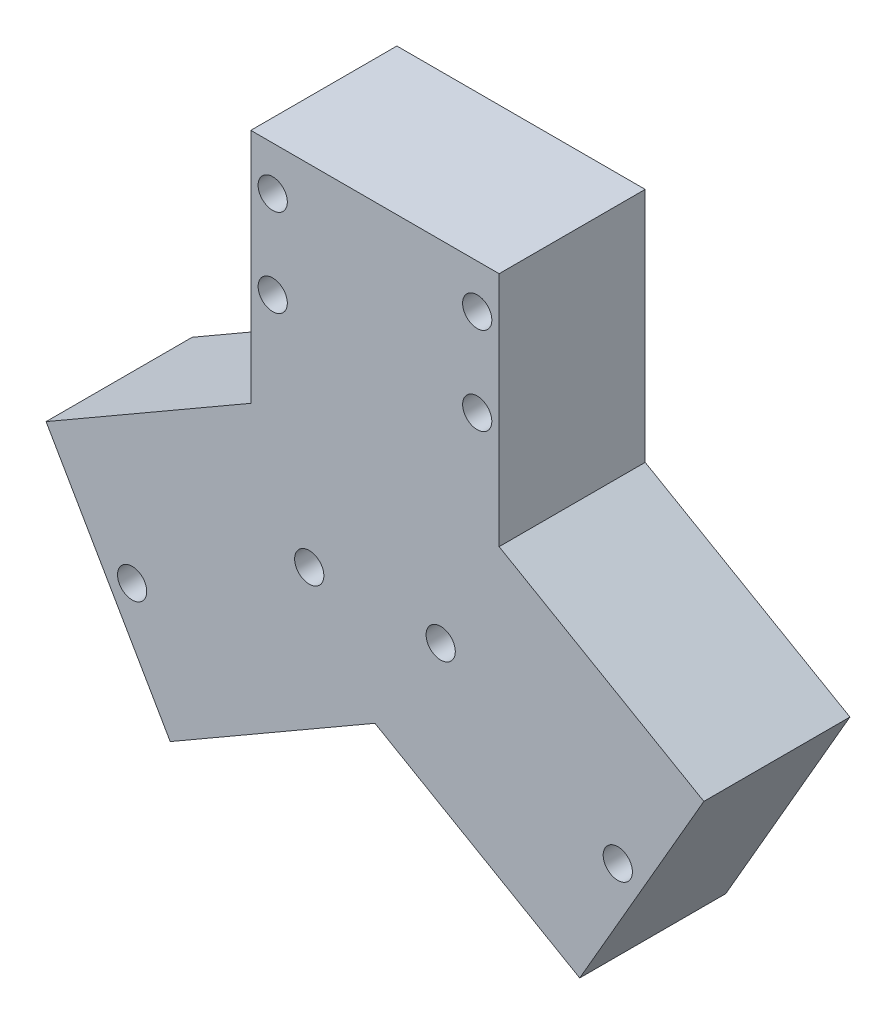
ISO-10303-21;
HEADER;
FILE_DESCRIPTION(('STEP AP214'),'2;1');
FILE_NAME('part.step','',(''),(''),'','','');
FILE_SCHEMA(('AUTOMOTIVE_DESIGN { 1 0 10303 214 1 1 1 1 }'));
ENDSEC;
DATA;
#1=APPLICATION_CONTEXT('core data for automotive mechanical design processes');
#2=APPLICATION_PROTOCOL_DEFINITION('international standard','automotive_design',2000,#1);
#3=PRODUCT_CONTEXT('',#1,'mechanical');
#4=PRODUCT('Part','Part','',(#3));
#5=PRODUCT_RELATED_PRODUCT_CATEGORY('part','',(#4));
#6=PRODUCT_DEFINITION_FORMATION('','',#4);
#7=PRODUCT_DEFINITION_CONTEXT('part definition',#1,'design');
#8=PRODUCT_DEFINITION('design','',#6,#7);
#9=PRODUCT_DEFINITION_SHAPE('','',#8);
#10=(LENGTH_UNIT() NAMED_UNIT(*) SI_UNIT(.MILLI.,.METRE.));
#11=(NAMED_UNIT(*) PLANE_ANGLE_UNIT() SI_UNIT($,.RADIAN.));
#12=(NAMED_UNIT(*) SI_UNIT($,.STERADIAN.) SOLID_ANGLE_UNIT());
#13=UNCERTAINTY_MEASURE_WITH_UNIT(LENGTH_MEASURE(1.E-05),#10,'distance_accuracy_value','');
#14=(GEOMETRIC_REPRESENTATION_CONTEXT(3) GLOBAL_UNCERTAINTY_ASSIGNED_CONTEXT((#13)) GLOBAL_UNIT_ASSIGNED_CONTEXT((#10,
#11,#12)) REPRESENTATION_CONTEXT('',''));
#15=CARTESIAN_POINT('',(0.,0.,0.));
#16=DIRECTION('',(0.,0.,1.));
#17=DIRECTION('',(1.,0.,0.));
#18=AXIS2_PLACEMENT_3D('',#15,#16,#17);
#19=CARTESIAN_POINT('',(-22.5166604983954,6.62990915244728,10.));
#20=DIRECTION('',(0.,0.,1.));
#21=DIRECTION('',(1.,0.,0.));
#22=AXIS2_PLACEMENT_3D('',#19,#20,#21);
#23=PLANE('',#22);
#24=CARTESIAN_POINT('',(4.5,7.,10.));
#25=DIRECTION('',(0.,0.,1.));
#26=DIRECTION('',(1.,0.,0.));
#27=AXIS2_PLACEMENT_3D('',#24,#25,#26);
#28=CIRCLE('',#27,1.);
#29=CARTESIAN_POINT('',(5.5,7.,10.));
#30=VERTEX_POINT('',#29);
#31=EDGE_CURVE('E226',#30,#30,#28,.T.);
#32=ORIENTED_EDGE('',*,*,#31,.F.);
#33=EDGE_LOOP('',(#32));
#34=FACE_BOUND('',#33,.T.);
#35=CARTESIAN_POINT('',(-16.6243556529821,0.,10.));
#36=DIRECTION('',(0.,0.,1.));
#37=DIRECTION('',(1.,0.,0.));
#38=AXIS2_PLACEMENT_3D('',#35,#36,#37);
#39=CIRCLE('',#38,1.);
#40=CARTESIAN_POINT('',(-15.6243556529821,0.,10.));
#41=VERTEX_POINT('',#40);
#42=EDGE_CURVE('E214',#41,#41,#39,.T.);
#43=ORIENTED_EDGE('',*,*,#42,.F.);
#44=EDGE_LOOP('',(#43));
#45=FACE_BOUND('',#44,.T.);
#46=CARTESIAN_POINT('',(-7.,21.9074772881118,10.));
#47=DIRECTION('',(0.,0.,1.));
#48=DIRECTION('',(1.,0.,0.));
#49=AXIS2_PLACEMENT_3D('',#46,#47,#48);
#50=CIRCLE('',#49,1.);
#51=CARTESIAN_POINT('',(-6.,21.9074772881118,10.));
#52=VERTEX_POINT('',#51);
#53=EDGE_CURVE('E202',#52,#52,#50,.T.);
#54=ORIENTED_EDGE('',*,*,#53,.F.);
#55=EDGE_LOOP('',(#54));
#56=FACE_BOUND('',#55,.T.);
#57=CARTESIAN_POINT('',(-7.,27.9074772881118,10.));
#58=DIRECTION('',(0.,0.,1.));
#59=DIRECTION('',(1.,0.,0.));
#60=AXIS2_PLACEMENT_3D('',#57,#58,#59);
#61=CIRCLE('',#60,1.);
#62=CARTESIAN_POINT('',(-6.,27.9074772881118,10.));
#63=VERTEX_POINT('',#62);
#64=EDGE_CURVE('E138',#63,#63,#61,.T.);
#65=ORIENTED_EDGE('',*,*,#64,.F.);
#66=EDGE_LOOP('',(#65));
#67=FACE_BOUND('',#66,.T.);
#68=DIRECTION('',(-0.866025403784438,-0.5,0.));
#69=VECTOR('',#68,1.);
#70=CARTESIAN_POINT('',(-22.5166604983954,6.62990915244727,10.));
#71=LINE('',#70,#69);
#72=CARTESIAN_POINT('',(-8.5,14.7224318643355,10.));
#73=VERTEX_POINT('',#72);
#74=CARTESIAN_POINT('',(-22.5166604983954,6.62990915244727,10.));
#75=VERTEX_POINT('',#74);
#76=EDGE_CURVE('E151',#73,#75,#71,.T.);
#77=ORIENTED_EDGE('',*,*,#76,.T.);
#78=DIRECTION('',(0.5,-0.866025403784439,0.));
#79=VECTOR('',#78,1.);
#80=CARTESIAN_POINT('',(-14.0166604983954,-8.09252271188818,10.));
#81=LINE('',#80,#79);
#82=CARTESIAN_POINT('',(-14.0166604983954,-8.09252271188818,10.));
#83=VERTEX_POINT('',#82);
#84=EDGE_CURVE('E94',#75,#83,#81,.T.);
#85=ORIENTED_EDGE('',*,*,#84,.T.);
#86=DIRECTION('',(0.866025403784438,0.5,0.));
#87=VECTOR('',#86,1.);
#88=CARTESIAN_POINT('',(0.,0.,10.));
#89=LINE('',#88,#87);
#90=CARTESIAN_POINT('',(0.,0.,10.));
#91=VERTEX_POINT('',#90);
#92=EDGE_CURVE('E169',#83,#91,#89,.T.);
#93=ORIENTED_EDGE('',*,*,#92,.T.);
#94=DIRECTION('',(0.866025403784439,-0.5,0.));
#95=VECTOR('',#94,1.);
#96=CARTESIAN_POINT('',(14.0166604983954,-8.09252271188818,10.));
#97=LINE('',#96,#95);
#98=CARTESIAN_POINT('',(14.0166604983954,-8.09252271188818,10.));
#99=VERTEX_POINT('',#98);
#100=EDGE_CURVE('E186',#91,#99,#97,.T.);
#101=ORIENTED_EDGE('',*,*,#100,.T.);
#102=DIRECTION('',(0.5,0.866025403784439,0.));
#103=VECTOR('',#102,1.);
#104=CARTESIAN_POINT('',(22.5166604983954,6.62990915244727,10.));
#105=LINE('',#104,#103);
#106=CARTESIAN_POINT('',(22.5166604983954,6.62990915244727,10.));
#107=VERTEX_POINT('',#106);
#108=EDGE_CURVE('E185',#99,#107,#105,.T.);
#109=ORIENTED_EDGE('',*,*,#108,.T.);
#110=DIRECTION('',(-0.866025403784439,0.5,0.));
#111=VECTOR('',#110,1.);
#112=CARTESIAN_POINT('',(8.5,14.7224318643355,10.));
#113=LINE('',#112,#111);
#114=CARTESIAN_POINT('',(8.5,14.7224318643355,10.));
#115=VERTEX_POINT('',#114);
#116=EDGE_CURVE('E116',#107,#115,#113,.T.);
#117=ORIENTED_EDGE('',*,*,#116,.T.);
#118=DIRECTION('',(0.,1.,0.));
#119=VECTOR('',#118,1.);
#120=CARTESIAN_POINT('',(8.5,30.9074772881118,10.));
#121=LINE('',#120,#119);
#122=CARTESIAN_POINT('',(8.5,30.9074772881118,10.));
#123=VERTEX_POINT('',#122);
#124=EDGE_CURVE('E110',#115,#123,#121,.T.);
#125=ORIENTED_EDGE('',*,*,#124,.T.);
#126=DIRECTION('',(-1.,0.,0.));
#127=VECTOR('',#126,1.);
#128=CARTESIAN_POINT('',(-8.5,30.9074772881118,10.));
#129=LINE('',#128,#127);
#130=CARTESIAN_POINT('',(-8.5,30.9074772881118,10.));
#131=VERTEX_POINT('',#130);
#132=EDGE_CURVE('E114',#123,#131,#129,.T.);
#133=ORIENTED_EDGE('',*,*,#132,.T.);
#134=DIRECTION('',(0.,-1.,0.));
#135=VECTOR('',#134,1.);
#136=CARTESIAN_POINT('',(-8.5,14.7224318643355,10.));
#137=LINE('',#136,#135);
#138=EDGE_CURVE('E48',#131,#73,#137,.T.);
#139=ORIENTED_EDGE('',*,*,#138,.T.);
#140=EDGE_LOOP('',(#77,#85,#93,#101,#109,#117,#125,#133,#139));
#141=FACE_BOUND('',#140,.T.);
#142=CARTESIAN_POINT('',(7.,27.9074772881118,10.));
#143=DIRECTION('',(0.,0.,1.));
#144=DIRECTION('',(1.,0.,0.));
#145=AXIS2_PLACEMENT_3D('',#142,#143,#144);
#146=CIRCLE('',#145,1.);
#147=CARTESIAN_POINT('',(8.,27.9074772881118,10.));
#148=VERTEX_POINT('',#147);
#149=EDGE_CURVE('E196',#148,#148,#146,.T.);
#150=ORIENTED_EDGE('',*,*,#149,.F.);
#151=EDGE_LOOP('',(#150));
#152=FACE_BOUND('',#151,.T.);
#153=CARTESIAN_POINT('',(7.,21.9074772881118,10.));
#154=DIRECTION('',(0.,0.,1.));
#155=DIRECTION('',(1.,0.,0.));
#156=AXIS2_PLACEMENT_3D('',#153,#154,#155);
#157=CIRCLE('',#156,1.);
#158=CARTESIAN_POINT('',(8.,21.9074772881118,10.));
#159=VERTEX_POINT('',#158);
#160=EDGE_CURVE('E208',#159,#159,#157,.T.);
#161=ORIENTED_EDGE('',*,*,#160,.F.);
#162=EDGE_LOOP('',(#161));
#163=FACE_BOUND('',#162,.T.);
#164=CARTESIAN_POINT('',(-4.5,7.,10.));
#165=DIRECTION('',(0.,0.,1.));
#166=DIRECTION('',(1.,0.,0.));
#167=AXIS2_PLACEMENT_3D('',#164,#165,#166);
#168=CIRCLE('',#167,1.);
#169=CARTESIAN_POINT('',(-3.5,7.,10.));
#170=VERTEX_POINT('',#169);
#171=EDGE_CURVE('E220',#170,#170,#168,.T.);
#172=ORIENTED_EDGE('',*,*,#171,.F.);
#173=EDGE_LOOP('',(#172));
#174=FACE_BOUND('',#173,.T.);
#175=CARTESIAN_POINT('',(16.6243556529821,0.,10.));
#176=DIRECTION('',(0.,0.,1.));
#177=DIRECTION('',(1.,0.,0.));
#178=AXIS2_PLACEMENT_3D('',#175,#176,#177);
#179=CIRCLE('',#178,1.);
#180=CARTESIAN_POINT('',(17.6243556529821,0.,10.));
#181=VERTEX_POINT('',#180);
#182=EDGE_CURVE('E232',#181,#181,#179,.T.);
#183=ORIENTED_EDGE('',*,*,#182,.F.);
#184=EDGE_LOOP('',(#183));
#185=FACE_BOUND('',#184,.T.);
#186=ADVANCED_FACE('F31',(#34,#45,#56,#67,#141,#152,#163,#174,#185),#23,.T.);
#187=CARTESIAN_POINT('',(-22.5166604983954,6.62990915244728,0.));
#188=DIRECTION('',(0.,0.,1.));
#189=DIRECTION('',(1.,0.,0.));
#190=AXIS2_PLACEMENT_3D('',#187,#188,#189);
#191=PLANE('',#190);
#192=CARTESIAN_POINT('',(4.5,7.,0.));
#193=DIRECTION('',(0.,0.,1.));
#194=DIRECTION('',(1.,0.,0.));
#195=AXIS2_PLACEMENT_3D('',#192,#193,#194);
#196=CIRCLE('',#195,1.);
#197=CARTESIAN_POINT('',(5.5,7.,0.));
#198=VERTEX_POINT('',#197);
#199=EDGE_CURVE('E229',#198,#198,#196,.T.);
#200=ORIENTED_EDGE('',*,*,#199,.T.);
#201=EDGE_LOOP('',(#200));
#202=FACE_BOUND('',#201,.T.);
#203=CARTESIAN_POINT('',(-16.6243556529821,0.,0.));
#204=DIRECTION('',(0.,0.,1.));
#205=DIRECTION('',(1.,0.,0.));
#206=AXIS2_PLACEMENT_3D('',#203,#204,#205);
#207=CIRCLE('',#206,1.);
#208=CARTESIAN_POINT('',(-15.6243556529821,0.,0.));
#209=VERTEX_POINT('',#208);
#210=EDGE_CURVE('E217',#209,#209,#207,.T.);
#211=ORIENTED_EDGE('',*,*,#210,.T.);
#212=EDGE_LOOP('',(#211));
#213=FACE_BOUND('',#212,.T.);
#214=CARTESIAN_POINT('',(-7.,21.9074772881118,0.));
#215=DIRECTION('',(0.,0.,1.));
#216=DIRECTION('',(1.,0.,0.));
#217=AXIS2_PLACEMENT_3D('',#214,#215,#216);
#218=CIRCLE('',#217,1.);
#219=CARTESIAN_POINT('',(-6.,21.9074772881118,0.));
#220=VERTEX_POINT('',#219);
#221=EDGE_CURVE('E205',#220,#220,#218,.T.);
#222=ORIENTED_EDGE('',*,*,#221,.T.);
#223=EDGE_LOOP('',(#222));
#224=FACE_BOUND('',#223,.T.);
#225=CARTESIAN_POINT('',(-7.,27.9074772881118,0.));
#226=DIRECTION('',(0.,0.,1.));
#227=DIRECTION('',(1.,0.,0.));
#228=AXIS2_PLACEMENT_3D('',#225,#226,#227);
#229=CIRCLE('',#228,1.);
#230=CARTESIAN_POINT('',(-6.,27.9074772881118,0.));
#231=VERTEX_POINT('',#230);
#232=EDGE_CURVE('E193',#231,#231,#229,.T.);
#233=ORIENTED_EDGE('',*,*,#232,.T.);
#234=EDGE_LOOP('',(#233));
#235=FACE_BOUND('',#234,.T.);
#236=DIRECTION('',(-0.866025403784438,-0.5,0.));
#237=VECTOR('',#236,1.);
#238=CARTESIAN_POINT('',(-22.5166604983954,6.62990915244727,0.));
#239=LINE('',#238,#237);
#240=CARTESIAN_POINT('',(-8.5,14.7224318643355,0.));
#241=VERTEX_POINT('',#240);
#242=CARTESIAN_POINT('',(-22.5166604983954,6.62990915244727,0.));
#243=VERTEX_POINT('',#242);
#244=EDGE_CURVE('E134',#241,#243,#239,.T.);
#245=ORIENTED_EDGE('',*,*,#244,.F.);
#246=DIRECTION('',(0.,-1.,0.));
#247=VECTOR('',#246,1.);
#248=CARTESIAN_POINT('',(-8.5,14.7224318643355,0.));
#249=LINE('',#248,#247);
#250=CARTESIAN_POINT('',(-8.5,30.9074772881118,0.));
#251=VERTEX_POINT('',#250);
#252=EDGE_CURVE('E86',#251,#241,#249,.T.);
#253=ORIENTED_EDGE('',*,*,#252,.F.);
#254=DIRECTION('',(-1.,0.,0.));
#255=VECTOR('',#254,1.);
#256=CARTESIAN_POINT('',(-8.5,30.9074772881118,0.));
#257=LINE('',#256,#255);
#258=CARTESIAN_POINT('',(8.5,30.9074772881118,0.));
#259=VERTEX_POINT('',#258);
#260=EDGE_CURVE('E80',#259,#251,#257,.T.);
#261=ORIENTED_EDGE('',*,*,#260,.F.);
#262=DIRECTION('',(0.,1.,0.));
#263=VECTOR('',#262,1.);
#264=CARTESIAN_POINT('',(8.5,30.9074772881118,0.));
#265=LINE('',#264,#263);
#266=CARTESIAN_POINT('',(8.5,14.7224318643355,0.));
#267=VERTEX_POINT('',#266);
#268=EDGE_CURVE('E124',#267,#259,#265,.T.);
#269=ORIENTED_EDGE('',*,*,#268,.F.);
#270=DIRECTION('',(-0.866025403784439,0.5,0.));
#271=VECTOR('',#270,1.);
#272=CARTESIAN_POINT('',(8.5,14.7224318643355,0.));
#273=LINE('',#272,#271);
#274=CARTESIAN_POINT('',(22.5166604983954,6.62990915244727,0.));
#275=VERTEX_POINT('',#274);
#276=EDGE_CURVE('E146',#275,#267,#273,.T.);
#277=ORIENTED_EDGE('',*,*,#276,.F.);
#278=DIRECTION('',(0.5,0.866025403784439,0.));
#279=VECTOR('',#278,1.);
#280=CARTESIAN_POINT('',(22.5166604983954,6.62990915244727,0.));
#281=LINE('',#280,#279);
#282=CARTESIAN_POINT('',(14.0166604983954,-8.09252271188818,0.));
#283=VERTEX_POINT('',#282);
#284=EDGE_CURVE('E144',#283,#275,#281,.T.);
#285=ORIENTED_EDGE('',*,*,#284,.F.);
#286=DIRECTION('',(0.866025403784439,-0.5,0.));
#287=VECTOR('',#286,1.);
#288=CARTESIAN_POINT('',(14.0166604983954,-8.09252271188818,0.));
#289=LINE('',#288,#287);
#290=CARTESIAN_POINT('',(0.,0.,0.));
#291=VERTEX_POINT('',#290);
#292=EDGE_CURVE('E142',#291,#283,#289,.T.);
#293=ORIENTED_EDGE('',*,*,#292,.F.);
#294=DIRECTION('',(0.866025403784438,0.5,0.));
#295=VECTOR('',#294,1.);
#296=CARTESIAN_POINT('',(0.,0.,0.));
#297=LINE('',#296,#295);
#298=CARTESIAN_POINT('',(-14.0166604983954,-8.09252271188818,0.));
#299=VERTEX_POINT('',#298);
#300=EDGE_CURVE('E140',#299,#291,#297,.T.);
#301=ORIENTED_EDGE('',*,*,#300,.F.);
#302=DIRECTION('',(0.5,-0.866025403784439,0.));
#303=VECTOR('',#302,1.);
#304=CARTESIAN_POINT('',(-14.0166604983954,-8.09252271188818,0.));
#305=LINE('',#304,#303);
#306=EDGE_CURVE('E137',#243,#299,#305,.T.);
#307=ORIENTED_EDGE('',*,*,#306,.F.);
#308=EDGE_LOOP('',(#245,#253,#261,#269,#277,#285,#293,#301,#307));
#309=FACE_BOUND('',#308,.T.);
#310=CARTESIAN_POINT('',(7.,27.9074772881118,0.));
#311=DIRECTION('',(0.,0.,1.));
#312=DIRECTION('',(1.,0.,0.));
#313=AXIS2_PLACEMENT_3D('',#310,#311,#312);
#314=CIRCLE('',#313,1.);
#315=CARTESIAN_POINT('',(8.,27.9074772881118,0.));
#316=VERTEX_POINT('',#315);
#317=EDGE_CURVE('E199',#316,#316,#314,.T.);
#318=ORIENTED_EDGE('',*,*,#317,.T.);
#319=EDGE_LOOP('',(#318));
#320=FACE_BOUND('',#319,.T.);
#321=CARTESIAN_POINT('',(7.,21.9074772881118,0.));
#322=DIRECTION('',(0.,0.,1.));
#323=DIRECTION('',(1.,0.,0.));
#324=AXIS2_PLACEMENT_3D('',#321,#322,#323);
#325=CIRCLE('',#324,1.);
#326=CARTESIAN_POINT('',(8.,21.9074772881118,0.));
#327=VERTEX_POINT('',#326);
#328=EDGE_CURVE('E211',#327,#327,#325,.T.);
#329=ORIENTED_EDGE('',*,*,#328,.T.);
#330=EDGE_LOOP('',(#329));
#331=FACE_BOUND('',#330,.T.);
#332=CARTESIAN_POINT('',(-4.5,7.,0.));
#333=DIRECTION('',(0.,0.,1.));
#334=DIRECTION('',(1.,0.,0.));
#335=AXIS2_PLACEMENT_3D('',#332,#333,#334);
#336=CIRCLE('',#335,1.);
#337=CARTESIAN_POINT('',(-3.5,7.,0.));
#338=VERTEX_POINT('',#337);
#339=EDGE_CURVE('E223',#338,#338,#336,.T.);
#340=ORIENTED_EDGE('',*,*,#339,.T.);
#341=EDGE_LOOP('',(#340));
#342=FACE_BOUND('',#341,.T.);
#343=CARTESIAN_POINT('',(16.6243556529821,0.,0.));
#344=DIRECTION('',(0.,0.,1.));
#345=DIRECTION('',(1.,0.,0.));
#346=AXIS2_PLACEMENT_3D('',#343,#344,#345);
#347=CIRCLE('',#346,1.);
#348=CARTESIAN_POINT('',(17.6243556529821,0.,0.));
#349=VERTEX_POINT('',#348);
#350=EDGE_CURVE('E235',#349,#349,#347,.T.);
#351=ORIENTED_EDGE('',*,*,#350,.T.);
#352=EDGE_LOOP('',(#351));
#353=FACE_BOUND('',#352,.T.);
#354=ADVANCED_FACE('F173',(#202,#213,#224,#235,#309,#320,#331,#342,#353),#191,.F.);
#355=CARTESIAN_POINT('',(-22.5166604983954,6.62990915244727,10.));
#356=DIRECTION('',(0.5,-0.866025403784438,0.));
#357=DIRECTION('',(0.866025403784438,0.5,0.));
#358=AXIS2_PLACEMENT_3D('',#355,#356,#357);
#359=PLANE('',#358);
#360=ORIENTED_EDGE('',*,*,#244,.T.);
#361=DIRECTION('',(0.,0.,-1.));
#362=VECTOR('',#361,1.);
#363=CARTESIAN_POINT('',(-22.5166604983954,6.62990915244727,10.));
#364=LINE('',#363,#362);
#365=EDGE_CURVE('E11',#75,#243,#364,.T.);
#366=ORIENTED_EDGE('',*,*,#365,.F.);
#367=ORIENTED_EDGE('',*,*,#76,.F.);
#368=DIRECTION('',(0.,0.,-1.));
#369=VECTOR('',#368,1.);
#370=CARTESIAN_POINT('',(-8.5,14.7224318643355,10.));
#371=LINE('',#370,#369);
#372=EDGE_CURVE('E130',#73,#241,#371,.T.);
#373=ORIENTED_EDGE('',*,*,#372,.T.);
#374=EDGE_LOOP('',(#360,#366,#367,#373));
#375=FACE_BOUND('',#374,.T.);
#376=ADVANCED_FACE('F33',(#375),#359,.F.);
#377=CARTESIAN_POINT('',(-14.0166604983954,-8.09252271188818,10.));
#378=DIRECTION('',(0.866025403784438,0.5,0.));
#379=DIRECTION('',(-0.5,0.866025403784438,0.));
#380=AXIS2_PLACEMENT_3D('',#377,#378,#379);
#381=PLANE('',#380);
#382=ORIENTED_EDGE('',*,*,#306,.T.);
#383=DIRECTION('',(0.,0.,-1.));
#384=VECTOR('',#383,1.);
#385=CARTESIAN_POINT('',(-14.0166604983954,-8.09252271188818,10.));
#386=LINE('',#385,#384);
#387=EDGE_CURVE('E40',#83,#299,#386,.T.);
#388=ORIENTED_EDGE('',*,*,#387,.F.);
#389=ORIENTED_EDGE('',*,*,#84,.F.);
#390=ORIENTED_EDGE('',*,*,#365,.T.);
#391=EDGE_LOOP('',(#382,#388,#389,#390));
#392=FACE_BOUND('',#391,.T.);
#393=ADVANCED_FACE('F274',(#392),#381,.F.);
#394=CARTESIAN_POINT('',(0.,0.,10.));
#395=DIRECTION('',(-0.5,0.866025403784438,0.));
#396=DIRECTION('',(-0.866025403784438,-0.5,0.));
#397=AXIS2_PLACEMENT_3D('',#394,#395,#396);
#398=PLANE('',#397);
#399=ORIENTED_EDGE('',*,*,#300,.T.);
#400=DIRECTION('',(0.,0.,-1.));
#401=VECTOR('',#400,1.);
#402=CARTESIAN_POINT('',(0.,0.,10.));
#403=LINE('',#402,#401);
#404=EDGE_CURVE('E161',#91,#291,#403,.T.);
#405=ORIENTED_EDGE('',*,*,#404,.F.);
#406=ORIENTED_EDGE('',*,*,#92,.F.);
#407=ORIENTED_EDGE('',*,*,#387,.T.);
#408=EDGE_LOOP('',(#399,#405,#406,#407));
#409=FACE_BOUND('',#408,.T.);
#410=ADVANCED_FACE('F167',(#409),#398,.F.);
#411=CARTESIAN_POINT('',(14.0166604983954,-8.09252271188818,10.));
#412=DIRECTION('',(0.5,0.866025403784439,0.));
#413=DIRECTION('',(-0.866025403784439,0.5,0.));
#414=AXIS2_PLACEMENT_3D('',#411,#412,#413);
#415=PLANE('',#414);
#416=ORIENTED_EDGE('',*,*,#292,.T.);
#417=DIRECTION('',(0.,0.,-1.));
#418=VECTOR('',#417,1.);
#419=CARTESIAN_POINT('',(14.0166604983954,-8.09252271188818,10.));
#420=LINE('',#419,#418);
#421=EDGE_CURVE('E158',#99,#283,#420,.T.);
#422=ORIENTED_EDGE('',*,*,#421,.F.);
#423=ORIENTED_EDGE('',*,*,#100,.F.);
#424=ORIENTED_EDGE('',*,*,#404,.T.);
#425=EDGE_LOOP('',(#416,#422,#423,#424));
#426=FACE_BOUND('',#425,.T.);
#427=ADVANCED_FACE('F179',(#426),#415,.F.);
#428=CARTESIAN_POINT('',(22.5166604983954,6.62990915244727,10.));
#429=DIRECTION('',(-0.866025403784438,0.5,0.));
#430=DIRECTION('',(-0.5,-0.866025403784438,0.));
#431=AXIS2_PLACEMENT_3D('',#428,#429,#430);
#432=PLANE('',#431);
#433=ORIENTED_EDGE('',*,*,#284,.T.);
#434=DIRECTION('',(0.,0.,-1.));
#435=VECTOR('',#434,1.);
#436=CARTESIAN_POINT('',(22.5166604983954,6.62990915244727,10.));
#437=LINE('',#436,#435);
#438=EDGE_CURVE('E155',#107,#275,#437,.T.);
#439=ORIENTED_EDGE('',*,*,#438,.F.);
#440=ORIENTED_EDGE('',*,*,#108,.F.);
#441=ORIENTED_EDGE('',*,*,#421,.T.);
#442=EDGE_LOOP('',(#433,#439,#440,#441));
#443=FACE_BOUND('',#442,.T.);
#444=ADVANCED_FACE('F183',(#443),#432,.F.);
#445=CARTESIAN_POINT('',(8.5,14.7224318643355,10.));
#446=DIRECTION('',(-0.5,-0.866025403784439,0.));
#447=DIRECTION('',(0.866025403784439,-0.5,0.));
#448=AXIS2_PLACEMENT_3D('',#445,#446,#447);
#449=PLANE('',#448);
#450=ORIENTED_EDGE('',*,*,#276,.T.);
#451=DIRECTION('',(0.,0.,-1.));
#452=VECTOR('',#451,1.);
#453=CARTESIAN_POINT('',(8.5,14.7224318643355,10.));
#454=LINE('',#453,#452);
#455=EDGE_CURVE('E125',#115,#267,#454,.T.);
#456=ORIENTED_EDGE('',*,*,#455,.F.);
#457=ORIENTED_EDGE('',*,*,#116,.F.);
#458=ORIENTED_EDGE('',*,*,#438,.T.);
#459=EDGE_LOOP('',(#450,#456,#457,#458));
#460=FACE_BOUND('',#459,.T.);
#461=ADVANCED_FACE('F265',(#460),#449,.F.);
#462=CARTESIAN_POINT('',(8.5,30.9074772881118,10.));
#463=DIRECTION('',(-1.,0.,0.));
#464=DIRECTION('',(0.,0.,1.));
#465=AXIS2_PLACEMENT_3D('',#462,#463,#464);
#466=PLANE('',#465);
#467=ORIENTED_EDGE('',*,*,#268,.T.);
#468=DIRECTION('',(0.,0.,-1.));
#469=VECTOR('',#468,1.);
#470=CARTESIAN_POINT('',(8.5,30.9074772881118,10.));
#471=LINE('',#470,#469);
#472=EDGE_CURVE('E121',#123,#259,#471,.T.);
#473=ORIENTED_EDGE('',*,*,#472,.F.);
#474=ORIENTED_EDGE('',*,*,#124,.F.);
#475=ORIENTED_EDGE('',*,*,#455,.T.);
#476=EDGE_LOOP('',(#467,#473,#474,#475));
#477=FACE_BOUND('',#476,.T.);
#478=ADVANCED_FACE('F122',(#477),#466,.F.);
#479=CARTESIAN_POINT('',(-8.5,30.9074772881118,10.));
#480=DIRECTION('',(0.,-1.,0.));
#481=DIRECTION('',(0.,0.,-1.));
#482=AXIS2_PLACEMENT_3D('',#479,#480,#481);
#483=PLANE('',#482);
#484=ORIENTED_EDGE('',*,*,#260,.T.);
#485=DIRECTION('',(0.,0.,-1.));
#486=VECTOR('',#485,1.);
#487=CARTESIAN_POINT('',(-8.5,30.9074772881118,10.));
#488=LINE('',#487,#486);
#489=EDGE_CURVE('E126',#131,#251,#488,.T.);
#490=ORIENTED_EDGE('',*,*,#489,.F.);
#491=ORIENTED_EDGE('',*,*,#132,.F.);
#492=ORIENTED_EDGE('',*,*,#472,.T.);
#493=EDGE_LOOP('',(#484,#490,#491,#492));
#494=FACE_BOUND('',#493,.T.);
#495=ADVANCED_FACE('F128',(#494),#483,.F.);
#496=CARTESIAN_POINT('',(-8.5,14.7224318643355,10.));
#497=DIRECTION('',(1.,0.,0.));
#498=DIRECTION('',(0.,0.,-1.));
#499=AXIS2_PLACEMENT_3D('',#496,#497,#498);
#500=PLANE('',#499);
#501=ORIENTED_EDGE('',*,*,#252,.T.);
#502=ORIENTED_EDGE('',*,*,#372,.F.);
#503=ORIENTED_EDGE('',*,*,#138,.F.);
#504=ORIENTED_EDGE('',*,*,#489,.T.);
#505=EDGE_LOOP('',(#501,#502,#503,#504));
#506=FACE_BOUND('',#505,.T.);
#507=ADVANCED_FACE('F258',(#506),#500,.F.);
#508=CARTESIAN_POINT('',(-7.,27.9074772881118,10.));
#509=DIRECTION('',(0.,0.,-1.));
#510=DIRECTION('',(-1.,0.,0.));
#511=AXIS2_PLACEMENT_3D('',#508,#509,#510);
#512=CYLINDRICAL_SURFACE('',#511,1.);
#513=ORIENTED_EDGE('',*,*,#64,.T.);
#514=EDGE_LOOP('',(#513));
#515=FACE_BOUND('',#514,.T.);
#516=ORIENTED_EDGE('',*,*,#232,.F.);
#517=EDGE_LOOP('',(#516));
#518=FACE_BOUND('',#517,.T.);
#519=ADVANCED_FACE('F255',(#515,#518),#512,.F.);
#520=CARTESIAN_POINT('',(7.,27.9074772881118,10.));
#521=DIRECTION('',(0.,0.,-1.));
#522=DIRECTION('',(-1.,0.,0.));
#523=AXIS2_PLACEMENT_3D('',#520,#521,#522);
#524=CYLINDRICAL_SURFACE('',#523,1.);
#525=ORIENTED_EDGE('',*,*,#149,.T.);
#526=EDGE_LOOP('',(#525));
#527=FACE_BOUND('',#526,.T.);
#528=ORIENTED_EDGE('',*,*,#317,.F.);
#529=EDGE_LOOP('',(#528));
#530=FACE_BOUND('',#529,.T.);
#531=ADVANCED_FACE('F343',(#527,#530),#524,.F.);
#532=CARTESIAN_POINT('',(-7.,21.9074772881118,10.));
#533=DIRECTION('',(0.,0.,-1.));
#534=DIRECTION('',(-1.,0.,0.));
#535=AXIS2_PLACEMENT_3D('',#532,#533,#534);
#536=CYLINDRICAL_SURFACE('',#535,1.);
#537=ORIENTED_EDGE('',*,*,#53,.T.);
#538=EDGE_LOOP('',(#537));
#539=FACE_BOUND('',#538,.T.);
#540=ORIENTED_EDGE('',*,*,#221,.F.);
#541=EDGE_LOOP('',(#540));
#542=FACE_BOUND('',#541,.T.);
#543=ADVANCED_FACE('F351',(#539,#542),#536,.F.);
#544=CARTESIAN_POINT('',(7.,21.9074772881118,10.));
#545=DIRECTION('',(0.,0.,-1.));
#546=DIRECTION('',(-1.,0.,0.));
#547=AXIS2_PLACEMENT_3D('',#544,#545,#546);
#548=CYLINDRICAL_SURFACE('',#547,1.);
#549=ORIENTED_EDGE('',*,*,#160,.T.);
#550=EDGE_LOOP('',(#549));
#551=FACE_BOUND('',#550,.T.);
#552=ORIENTED_EDGE('',*,*,#328,.F.);
#553=EDGE_LOOP('',(#552));
#554=FACE_BOUND('',#553,.T.);
#555=ADVANCED_FACE('F359',(#551,#554),#548,.F.);
#556=CARTESIAN_POINT('',(-16.6243556529821,0.,10.));
#557=DIRECTION('',(0.,0.,-1.));
#558=DIRECTION('',(-1.,0.,0.));
#559=AXIS2_PLACEMENT_3D('',#556,#557,#558);
#560=CYLINDRICAL_SURFACE('',#559,1.);
#561=ORIENTED_EDGE('',*,*,#42,.T.);
#562=EDGE_LOOP('',(#561));
#563=FACE_BOUND('',#562,.T.);
#564=ORIENTED_EDGE('',*,*,#210,.F.);
#565=EDGE_LOOP('',(#564));
#566=FACE_BOUND('',#565,.T.);
#567=ADVANCED_FACE('F368',(#563,#566),#560,.F.);
#568=CARTESIAN_POINT('',(-4.5,7.,10.));
#569=DIRECTION('',(0.,0.,-1.));
#570=DIRECTION('',(-1.,0.,0.));
#571=AXIS2_PLACEMENT_3D('',#568,#569,#570);
#572=CYLINDRICAL_SURFACE('',#571,1.);
#573=ORIENTED_EDGE('',*,*,#171,.T.);
#574=EDGE_LOOP('',(#573));
#575=FACE_BOUND('',#574,.T.);
#576=ORIENTED_EDGE('',*,*,#339,.F.);
#577=EDGE_LOOP('',(#576));
#578=FACE_BOUND('',#577,.T.);
#579=ADVANCED_FACE('F377',(#575,#578),#572,.F.);
#580=CARTESIAN_POINT('',(4.5,7.,10.));
#581=DIRECTION('',(0.,0.,-1.));
#582=DIRECTION('',(-1.,0.,0.));
#583=AXIS2_PLACEMENT_3D('',#580,#581,#582);
#584=CYLINDRICAL_SURFACE('',#583,1.);
#585=ORIENTED_EDGE('',*,*,#31,.T.);
#586=EDGE_LOOP('',(#585));
#587=FACE_BOUND('',#586,.T.);
#588=ORIENTED_EDGE('',*,*,#199,.F.);
#589=EDGE_LOOP('',(#588));
#590=FACE_BOUND('',#589,.T.);
#591=ADVANCED_FACE('F386',(#587,#590),#584,.F.);
#592=CARTESIAN_POINT('',(16.6243556529821,0.,10.));
#593=DIRECTION('',(0.,0.,-1.));
#594=DIRECTION('',(-1.,0.,0.));
#595=AXIS2_PLACEMENT_3D('',#592,#593,#594);
#596=CYLINDRICAL_SURFACE('',#595,1.);
#597=ORIENTED_EDGE('',*,*,#182,.T.);
#598=EDGE_LOOP('',(#597));
#599=FACE_BOUND('',#598,.T.);
#600=ORIENTED_EDGE('',*,*,#350,.F.);
#601=EDGE_LOOP('',(#600));
#602=FACE_BOUND('',#601,.T.);
#603=ADVANCED_FACE('F241',(#599,#602),#596,.F.);
#604=CLOSED_SHELL('',(#186,#354,#376,#393,#410,#427,#444,#461,#478,#495,#507,#519,#531,#543,
#555,#567,#579,#591,#603));
#605=MANIFOLD_SOLID_BREP('B2',#604);
#606=ADVANCED_BREP_SHAPE_REPRESENTATION('',(#18,#605),#14);
#607=SHAPE_DEFINITION_REPRESENTATION(#9,#606);
ENDSEC;
END-ISO-10303-21;
